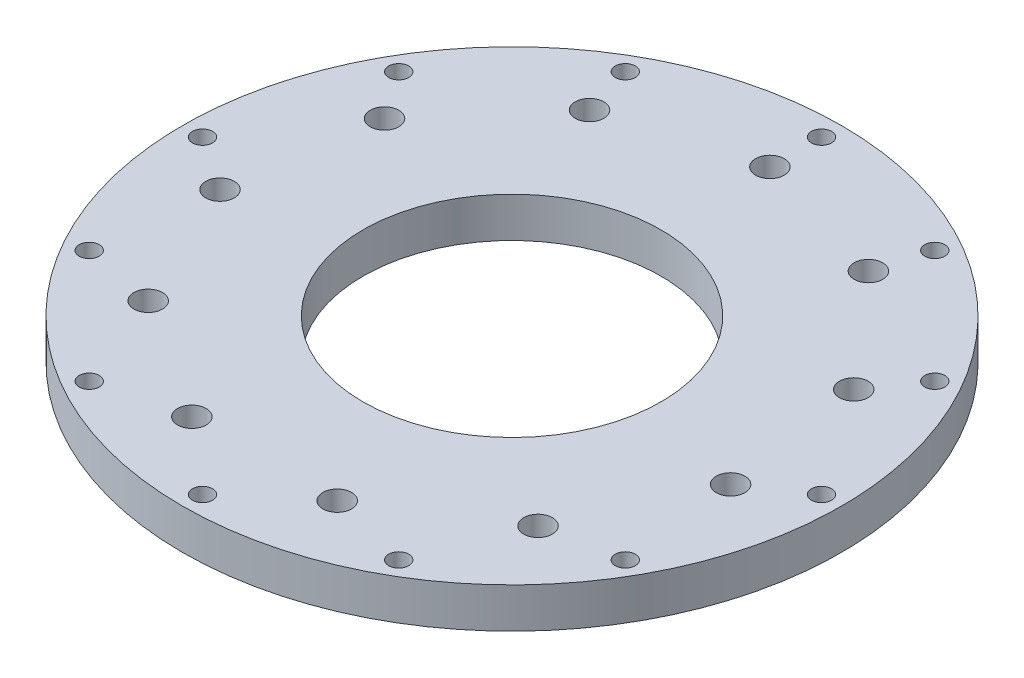
ISO-10303-21;
HEADER;
FILE_DESCRIPTION(('STEP AP214'),'2;1');
FILE_NAME('part.step','',(''),(''),'','','');
FILE_SCHEMA(('AUTOMOTIVE_DESIGN { 1 0 10303 214 1 1 1 1 }'));
ENDSEC;
DATA;
#1=APPLICATION_CONTEXT('core data for automotive mechanical design processes');
#2=APPLICATION_PROTOCOL_DEFINITION('international standard','automotive_design',2000,#1);
#3=PRODUCT_CONTEXT('',#1,'mechanical');
#4=PRODUCT('Part','Part','',(#3));
#5=PRODUCT_RELATED_PRODUCT_CATEGORY('part','',(#4));
#6=PRODUCT_DEFINITION_FORMATION('','',#4);
#7=PRODUCT_DEFINITION_CONTEXT('part definition',#1,'design');
#8=PRODUCT_DEFINITION('design','',#6,#7);
#9=PRODUCT_DEFINITION_SHAPE('','',#8);
#10=(LENGTH_UNIT() NAMED_UNIT(*) SI_UNIT(.MILLI.,.METRE.));
#11=(NAMED_UNIT(*) PLANE_ANGLE_UNIT() SI_UNIT($,.RADIAN.));
#12=(NAMED_UNIT(*) SI_UNIT($,.STERADIAN.) SOLID_ANGLE_UNIT());
#13=UNCERTAINTY_MEASURE_WITH_UNIT(LENGTH_MEASURE(1.E-05),#10,'distance_accuracy_value','');
#14=(GEOMETRIC_REPRESENTATION_CONTEXT(3) GLOBAL_UNCERTAINTY_ASSIGNED_CONTEXT((#13)) GLOBAL_UNIT_ASSIGNED_CONTEXT((#10,
#11,#12)) REPRESENTATION_CONTEXT('',''));
#15=CARTESIAN_POINT('',(0.,0.,0.));
#16=DIRECTION('',(0.,0.,1.));
#17=DIRECTION('',(1.,0.,0.));
#18=AXIS2_PLACEMENT_3D('',#15,#16,#17);
#19=CARTESIAN_POINT('',(0.,7.,0.));
#20=DIRECTION('',(0.,1.,0.));
#21=DIRECTION('',(0.,0.,1.));
#22=AXIS2_PLACEMENT_3D('',#19,#20,#21);
#23=PLANE('',#22);
#24=CARTESIAN_POINT('',(-40.9334397909518,7.,-18.6936755850826));
#25=DIRECTION('',(0.,1.,0.));
#26=DIRECTION('',(0.,0.,1.));
#27=AXIS2_PLACEMENT_3D('',#24,#25,#26);
#28=CIRCLE('',#27,2.50000000000264);
#29=CARTESIAN_POINT('',(-40.9334397909518,7.,-16.1936755850799));
#30=VERTEX_POINT('',#29);
#31=EDGE_CURVE('E173',#30,#30,#28,.T.);
#32=ORIENTED_EDGE('',*,*,#31,.F.);
#33=EDGE_LOOP('',(#32));
#34=FACE_BOUND('',#33,.T.);
#35=CARTESIAN_POINT('',(-34.0087308459374,7.,29.4687330275398));
#36=DIRECTION('',(0.,1.,0.));
#37=DIRECTION('',(0.,0.,1.));
#38=AXIS2_PLACEMENT_3D('',#35,#36,#37);
#39=CIRCLE('',#38,2.50000000000499);
#40=CARTESIAN_POINT('',(-34.0087308459374,7.,31.9687330275448));
#41=VERTEX_POINT('',#40);
#42=EDGE_CURVE('E161',#41,#41,#39,.T.);
#43=ORIENTED_EDGE('',*,*,#42,.F.);
#44=EDGE_LOOP('',(#43));
#45=FACE_BOUND('',#44,.T.);
#46=CARTESIAN_POINT('',(12.6779650578693,7.,43.1771838126517));
#47=DIRECTION('',(0.,1.,0.));
#48=DIRECTION('',(0.,0.,1.));
#49=AXIS2_PLACEMENT_3D('',#46,#47,#48);
#50=CIRCLE('',#49,2.50000000000485);
#51=CARTESIAN_POINT('',(12.6779650578693,7.,45.6771838126565));
#52=VERTEX_POINT('',#51);
#53=EDGE_CURVE('E149',#52,#52,#50,.T.);
#54=ORIENTED_EDGE('',*,*,#53,.F.);
#55=EDGE_LOOP('',(#54));
#56=FACE_BOUND('',#55,.T.);
#57=CARTESIAN_POINT('',(44.5419648846449,7.,6.4041677222953));
#58=DIRECTION('',(0.,1.,0.));
#59=DIRECTION('',(0.,0.,1.));
#60=AXIS2_PLACEMENT_3D('',#57,#58,#59);
#61=CIRCLE('',#60,2.50000000000221);
#62=CARTESIAN_POINT('',(44.5419648846449,7.,8.90416772229752));
#63=VERTEX_POINT('',#62);
#64=EDGE_CURVE('E137',#63,#63,#61,.T.);
#65=ORIENTED_EDGE('',*,*,#64,.F.);
#66=EDGE_LOOP('',(#65));
#67=FACE_BOUND('',#66,.T.);
#68=CARTESIAN_POINT('',(24.3288367855023,7.,-37.8564089774045));
#69=DIRECTION('',(0.,1.,0.));
#70=DIRECTION('',(0.,0.,1.));
#71=AXIS2_PLACEMENT_3D('',#68,#69,#70);
#72=CIRCLE('',#71,2.50000000000002);
#73=CARTESIAN_POINT('',(24.3288367855023,7.,-35.3564089774045));
#74=VERTEX_POINT('',#73);
#75=EDGE_CURVE('E125',#74,#74,#72,.T.);
#76=ORIENTED_EDGE('',*,*,#75,.F.);
#77=EDGE_LOOP('',(#76));
#78=FACE_BOUND('',#77,.T.);
#79=CARTESIAN_POINT('',(-26.9999999999997,7.,-46.7653718043585));
#80=DIRECTION('',(0.,1.,0.));
#81=DIRECTION('',(0.,0.,1.));
#82=AXIS2_PLACEMENT_3D('',#79,#80,#81);
#83=CIRCLE('',#82,1.75);
#84=CARTESIAN_POINT('',(-26.9999999999997,7.,-45.0153718043585));
#85=VERTEX_POINT('',#84);
#86=EDGE_CURVE('E113',#85,#85,#83,.T.);
#87=ORIENTED_EDGE('',*,*,#86,.F.);
#88=EDGE_LOOP('',(#87));
#89=FACE_BOUND('',#88,.T.);
#90=CARTESIAN_POINT('',(-53.9999999999977,7.,2.3412395522908E-12));
#91=DIRECTION('',(0.,1.,0.));
#92=DIRECTION('',(0.,0.,1.));
#93=AXIS2_PLACEMENT_3D('',#90,#91,#92);
#94=CIRCLE('',#93,1.75);
#95=CARTESIAN_POINT('',(-53.9999999999977,7.,1.75000000000234));
#96=VERTEX_POINT('',#95);
#97=EDGE_CURVE('E101',#96,#96,#94,.T.);
#98=ORIENTED_EDGE('',*,*,#97,.F.);
#99=EDGE_LOOP('',(#98));
#100=FACE_BOUND('',#99,.T.);
#101=CARTESIAN_POINT('',(-26.9999999999956,7.,46.7653718043609));
#102=DIRECTION('',(0.,1.,0.));
#103=DIRECTION('',(0.,0.,1.));
#104=AXIS2_PLACEMENT_3D('',#101,#102,#103);
#105=CIRCLE('',#104,1.75);
#106=CARTESIAN_POINT('',(-26.9999999999956,7.,48.5153718043609));
#107=VERTEX_POINT('',#106);
#108=EDGE_CURVE('E89',#107,#107,#105,.T.);
#109=ORIENTED_EDGE('',*,*,#108,.F.);
#110=EDGE_LOOP('',(#109));
#111=FACE_BOUND('',#110,.T.);
#112=CARTESIAN_POINT('',(27.0000000000044,7.,46.7653718043585));
#113=DIRECTION('',(0.,1.,0.));
#114=DIRECTION('',(0.,0.,1.));
#115=AXIS2_PLACEMENT_3D('',#112,#113,#114);
#116=CIRCLE('',#115,1.75);
#117=CARTESIAN_POINT('',(27.0000000000044,7.,48.5153718043585));
#118=VERTEX_POINT('',#117);
#119=EDGE_CURVE('E77',#118,#118,#116,.T.);
#120=ORIENTED_EDGE('',*,*,#119,.F.);
#121=EDGE_LOOP('',(#120));
#122=FACE_BOUND('',#121,.T.);
#123=CARTESIAN_POINT('',(54.0000000000023,7.,-2.33462645957541E-12));
#124=DIRECTION('',(0.,1.,0.));
#125=DIRECTION('',(0.,0.,1.));
#126=AXIS2_PLACEMENT_3D('',#123,#124,#125);
#127=CIRCLE('',#126,1.75);
#128=CARTESIAN_POINT('',(54.0000000000023,7.,1.74999999999767));
#129=VERTEX_POINT('',#128);
#130=EDGE_CURVE('E65',#129,#129,#127,.T.);
#131=ORIENTED_EDGE('',*,*,#130,.F.);
#132=EDGE_LOOP('',(#131));
#133=FACE_BOUND('',#132,.T.);
#134=CARTESIAN_POINT('',(27.0000000000003,7.,-46.7653718043608));
#135=DIRECTION('',(0.,1.,0.));
#136=DIRECTION('',(0.,0.,1.));
#137=AXIS2_PLACEMENT_3D('',#134,#135,#136);
#138=CIRCLE('',#137,1.75);
#139=CARTESIAN_POINT('',(27.0000000000003,7.,-45.0153718043608));
#140=VERTEX_POINT('',#139);
#141=EDGE_CURVE('E53',#140,#140,#138,.T.);
#142=ORIENTED_EDGE('',*,*,#141,.F.);
#143=EDGE_LOOP('',(#142));
#144=FACE_BOUND('',#143,.T.);
#145=CARTESIAN_POINT('',(0.,7.,-54.));
#146=DIRECTION('',(0.,1.,0.));
#147=DIRECTION('',(0.,0.,1.));
#148=AXIS2_PLACEMENT_3D('',#145,#146,#147);
#149=CIRCLE('',#148,1.75);
#150=CARTESIAN_POINT('',(0.,7.,-52.25));
#151=VERTEX_POINT('',#150);
#152=EDGE_CURVE('E42',#151,#151,#149,.T.);
#153=ORIENTED_EDGE('',*,*,#152,.F.);
#154=EDGE_LOOP('',(#153));
#155=FACE_BOUND('',#154,.T.);
#156=CARTESIAN_POINT('',(0.,7.,0.));
#157=DIRECTION('',(0.,1.,0.));
#158=DIRECTION('',(0.,0.,1.));
#159=AXIS2_PLACEMENT_3D('',#156,#157,#158);
#160=CIRCLE('',#159,57.5);
#161=CARTESIAN_POINT('',(0.,7.,57.5));
#162=VERTEX_POINT('',#161);
#163=EDGE_CURVE('E10',#162,#162,#160,.T.);
#164=ORIENTED_EDGE('',*,*,#163,.T.);
#165=EDGE_LOOP('',(#164));
#166=FACE_BOUND('',#165,.T.);
#167=CARTESIAN_POINT('',(0.,7.,0.));
#168=DIRECTION('',(0.,1.,0.));
#169=DIRECTION('',(0.,0.,1.));
#170=AXIS2_PLACEMENT_3D('',#167,#168,#169);
#171=CIRCLE('',#170,26.);
#172=CARTESIAN_POINT('',(0.,7.,26.));
#173=VERTEX_POINT('',#172);
#174=EDGE_CURVE('E47',#173,#173,#171,.T.);
#175=ORIENTED_EDGE('',*,*,#174,.F.);
#176=EDGE_LOOP('',(#175));
#177=FACE_BOUND('',#176,.T.);
#178=CARTESIAN_POINT('',(46.7653718043608,7.,-27.000000000002));
#179=DIRECTION('',(0.,1.,0.));
#180=DIRECTION('',(0.,0.,1.));
#181=AXIS2_PLACEMENT_3D('',#178,#179,#180);
#182=CIRCLE('',#181,1.75);
#183=CARTESIAN_POINT('',(46.7653718043608,7.,-25.250000000002));
#184=VERTEX_POINT('',#183);
#185=EDGE_CURVE('E59',#184,#184,#182,.T.);
#186=ORIENTED_EDGE('',*,*,#185,.F.);
#187=EDGE_LOOP('',(#186));
#188=FACE_BOUND('',#187,.T.);
#189=CARTESIAN_POINT('',(46.7653718043632,7.,26.999999999998));
#190=DIRECTION('',(0.,1.,0.));
#191=DIRECTION('',(0.,0.,1.));
#192=AXIS2_PLACEMENT_3D('',#189,#190,#191);
#193=CIRCLE('',#192,1.75);
#194=CARTESIAN_POINT('',(46.7653718043632,7.,28.749999999998));
#195=VERTEX_POINT('',#194);
#196=EDGE_CURVE('E71',#195,#195,#193,.T.);
#197=ORIENTED_EDGE('',*,*,#196,.F.);
#198=EDGE_LOOP('',(#197));
#199=FACE_BOUND('',#198,.T.);
#200=CARTESIAN_POINT('',(4.66925291915082E-12,7.,54.));
#201=DIRECTION('',(0.,1.,0.));
#202=DIRECTION('',(0.,0.,1.));
#203=AXIS2_PLACEMENT_3D('',#200,#201,#202);
#204=CIRCLE('',#203,1.75);
#205=CARTESIAN_POINT('',(4.66925291915082E-12,7.,55.75));
#206=VERTEX_POINT('',#205);
#207=EDGE_CURVE('E83',#206,#206,#204,.T.);
#208=ORIENTED_EDGE('',*,*,#207,.F.);
#209=EDGE_LOOP('',(#208));
#210=FACE_BOUND('',#209,.T.);
#211=CARTESIAN_POINT('',(-46.7653718043562,7.,27.000000000002));
#212=DIRECTION('',(0.,1.,0.));
#213=DIRECTION('',(0.,0.,1.));
#214=AXIS2_PLACEMENT_3D('',#211,#212,#213);
#215=CIRCLE('',#214,1.75);
#216=CARTESIAN_POINT('',(-46.7653718043562,7.,28.750000000002));
#217=VERTEX_POINT('',#216);
#218=EDGE_CURVE('E95',#217,#217,#215,.T.);
#219=ORIENTED_EDGE('',*,*,#218,.F.);
#220=EDGE_LOOP('',(#219));
#221=FACE_BOUND('',#220,.T.);
#222=CARTESIAN_POINT('',(-46.7653718043585,7.,-26.9999999999979));
#223=DIRECTION('',(0.,1.,0.));
#224=DIRECTION('',(0.,0.,1.));
#225=AXIS2_PLACEMENT_3D('',#222,#223,#224);
#226=CIRCLE('',#225,1.75);
#227=CARTESIAN_POINT('',(-46.7653718043585,7.,-25.2499999999979));
#228=VERTEX_POINT('',#227);
#229=EDGE_CURVE('E107',#228,#228,#226,.T.);
#230=ORIENTED_EDGE('',*,*,#229,.F.);
#231=EDGE_LOOP('',(#230));
#232=FACE_BOUND('',#231,.T.);
#233=CARTESIAN_POINT('',(0.,7.,-45.));
#234=DIRECTION('',(0.,1.,0.));
#235=DIRECTION('',(0.,0.,1.));
#236=AXIS2_PLACEMENT_3D('',#233,#234,#235);
#237=CIRCLE('',#236,2.5);
#238=CARTESIAN_POINT('',(0.,7.,-42.5));
#239=VERTEX_POINT('',#238);
#240=EDGE_CURVE('E119',#239,#239,#237,.T.);
#241=ORIENTED_EDGE('',*,*,#240,.F.);
#242=EDGE_LOOP('',(#241));
#243=FACE_BOUND('',#242,.T.);
#244=CARTESIAN_POINT('',(40.9334397909548,7.,-18.6936755850872));
#245=DIRECTION('',(0.,1.,0.));
#246=DIRECTION('',(0.,0.,1.));
#247=AXIS2_PLACEMENT_3D('',#244,#245,#246);
#248=CIRCLE('',#247,2.50000000000086);
#249=CARTESIAN_POINT('',(40.9334397909548,7.,-16.1936755850863));
#250=VERTEX_POINT('',#249);
#251=EDGE_CURVE('E131',#250,#250,#248,.T.);
#252=ORIENTED_EDGE('',*,*,#251,.F.);
#253=EDGE_LOOP('',(#252));
#254=FACE_BOUND('',#253,.T.);
#255=CARTESIAN_POINT('',(34.0087308459458,7.,29.4687330275359));
#256=DIRECTION('',(0.,1.,0.));
#257=DIRECTION('',(0.,0.,1.));
#258=AXIS2_PLACEMENT_3D('',#255,#256,#257);
#259=CIRCLE('',#258,2.5000000000037);
#260=CARTESIAN_POINT('',(34.0087308459458,7.,31.9687330275396));
#261=VERTEX_POINT('',#260);
#262=EDGE_CURVE('E143',#261,#261,#259,.T.);
#263=ORIENTED_EDGE('',*,*,#262,.F.);
#264=EDGE_LOOP('',(#263));
#265=FACE_BOUND('',#264,.T.);
#266=CARTESIAN_POINT('',(-12.6779650578593,7.,43.1771838126531));
#267=DIRECTION('',(0.,1.,0.));
#268=DIRECTION('',(0.,0.,1.));
#269=AXIS2_PLACEMENT_3D('',#266,#267,#268);
#270=CIRCLE('',#269,2.50000000000533);
#271=CARTESIAN_POINT('',(-12.6779650578593,7.,45.6771838126584));
#272=VERTEX_POINT('',#271);
#273=EDGE_CURVE('E155',#272,#272,#270,.T.);
#274=ORIENTED_EDGE('',*,*,#273,.F.);
#275=EDGE_LOOP('',(#274));
#276=FACE_BOUND('',#275,.T.);
#277=CARTESIAN_POINT('',(-44.5419648846391,7.,6.40416772230036));
#278=DIRECTION('',(0.,1.,0.));
#279=DIRECTION('',(0.,0.,1.));
#280=AXIS2_PLACEMENT_3D('',#277,#278,#279);
#281=CIRCLE('',#280,2.50000000000398);
#282=CARTESIAN_POINT('',(-44.5419648846391,7.,8.90416772230433));
#283=VERTEX_POINT('',#282);
#284=EDGE_CURVE('E167',#283,#283,#281,.T.);
#285=ORIENTED_EDGE('',*,*,#284,.F.);
#286=EDGE_LOOP('',(#285));
#287=FACE_BOUND('',#286,.T.);
#288=CARTESIAN_POINT('',(-24.3288367855015,7.,-37.8564089774018));
#289=DIRECTION('',(0.,1.,0.));
#290=DIRECTION('',(0.,0.,1.));
#291=AXIS2_PLACEMENT_3D('',#288,#289,#290);
#292=CIRCLE('',#291,2.50000000000136);
#293=CARTESIAN_POINT('',(-24.3288367855015,7.,-35.3564089774004));
#294=VERTEX_POINT('',#293);
#295=EDGE_CURVE('E179',#294,#294,#292,.T.);
#296=ORIENTED_EDGE('',*,*,#295,.F.);
#297=EDGE_LOOP('',(#296));
#298=FACE_BOUND('',#297,.T.);
#299=ADVANCED_FACE('F31',(#34,#45,#56,#67,#78,#89,#100,#111,#122,#133,#144,#155,#166,#177,#188,
#199,#210,#221,#232,#243,#254,#265,#276,#287,#298),#23,.T.);
#300=CARTESIAN_POINT('',(0.,0.,0.));
#301=DIRECTION('',(0.,1.,0.));
#302=DIRECTION('',(0.,0.,1.));
#303=AXIS2_PLACEMENT_3D('',#300,#301,#302);
#304=PLANE('',#303);
#305=CARTESIAN_POINT('',(0.,0.,0.));
#306=DIRECTION('',(0.,1.,0.));
#307=DIRECTION('',(0.,0.,1.));
#308=AXIS2_PLACEMENT_3D('',#305,#306,#307);
#309=CIRCLE('',#308,57.5);
#310=CARTESIAN_POINT('',(0.,0.,57.5));
#311=VERTEX_POINT('',#310);
#312=EDGE_CURVE('E35',#311,#311,#309,.T.);
#313=ORIENTED_EDGE('',*,*,#312,.F.);
#314=EDGE_LOOP('',(#313));
#315=FACE_BOUND('',#314,.T.);
#316=CARTESIAN_POINT('',(0.,0.,-54.));
#317=DIRECTION('',(0.,1.,0.));
#318=DIRECTION('',(0.,0.,1.));
#319=AXIS2_PLACEMENT_3D('',#316,#317,#318);
#320=CIRCLE('',#319,1.75);
#321=CARTESIAN_POINT('',(0.,0.,-52.25));
#322=VERTEX_POINT('',#321);
#323=EDGE_CURVE('E44',#322,#322,#320,.T.);
#324=ORIENTED_EDGE('',*,*,#323,.T.);
#325=EDGE_LOOP('',(#324));
#326=FACE_BOUND('',#325,.T.);
#327=CARTESIAN_POINT('',(0.,0.,0.));
#328=DIRECTION('',(0.,1.,0.));
#329=DIRECTION('',(0.,0.,1.));
#330=AXIS2_PLACEMENT_3D('',#327,#328,#329);
#331=CIRCLE('',#330,26.);
#332=CARTESIAN_POINT('',(0.,0.,26.));
#333=VERTEX_POINT('',#332);
#334=EDGE_CURVE('E50',#333,#333,#331,.T.);
#335=ORIENTED_EDGE('',*,*,#334,.T.);
#336=EDGE_LOOP('',(#335));
#337=FACE_BOUND('',#336,.T.);
#338=CARTESIAN_POINT('',(27.0000000000003,0.,-46.7653718043608));
#339=DIRECTION('',(0.,1.,0.));
#340=DIRECTION('',(0.,0.,1.));
#341=AXIS2_PLACEMENT_3D('',#338,#339,#340);
#342=CIRCLE('',#341,1.75);
#343=CARTESIAN_POINT('',(27.0000000000003,0.,-45.0153718043608));
#344=VERTEX_POINT('',#343);
#345=EDGE_CURVE('E56',#344,#344,#342,.T.);
#346=ORIENTED_EDGE('',*,*,#345,.T.);
#347=EDGE_LOOP('',(#346));
#348=FACE_BOUND('',#347,.T.);
#349=CARTESIAN_POINT('',(46.7653718043608,0.,-27.000000000002));
#350=DIRECTION('',(0.,1.,0.));
#351=DIRECTION('',(0.,0.,1.));
#352=AXIS2_PLACEMENT_3D('',#349,#350,#351);
#353=CIRCLE('',#352,1.75);
#354=CARTESIAN_POINT('',(46.7653718043608,0.,-25.250000000002));
#355=VERTEX_POINT('',#354);
#356=EDGE_CURVE('E62',#355,#355,#353,.T.);
#357=ORIENTED_EDGE('',*,*,#356,.T.);
#358=EDGE_LOOP('',(#357));
#359=FACE_BOUND('',#358,.T.);
#360=CARTESIAN_POINT('',(54.0000000000023,0.,-2.33462645957541E-12));
#361=DIRECTION('',(0.,1.,0.));
#362=DIRECTION('',(0.,0.,1.));
#363=AXIS2_PLACEMENT_3D('',#360,#361,#362);
#364=CIRCLE('',#363,1.75);
#365=CARTESIAN_POINT('',(54.0000000000023,0.,1.74999999999767));
#366=VERTEX_POINT('',#365);
#367=EDGE_CURVE('E68',#366,#366,#364,.T.);
#368=ORIENTED_EDGE('',*,*,#367,.T.);
#369=EDGE_LOOP('',(#368));
#370=FACE_BOUND('',#369,.T.);
#371=CARTESIAN_POINT('',(46.7653718043632,0.,26.999999999998));
#372=DIRECTION('',(0.,1.,0.));
#373=DIRECTION('',(0.,0.,1.));
#374=AXIS2_PLACEMENT_3D('',#371,#372,#373);
#375=CIRCLE('',#374,1.75);
#376=CARTESIAN_POINT('',(46.7653718043632,0.,28.749999999998));
#377=VERTEX_POINT('',#376);
#378=EDGE_CURVE('E74',#377,#377,#375,.T.);
#379=ORIENTED_EDGE('',*,*,#378,.T.);
#380=EDGE_LOOP('',(#379));
#381=FACE_BOUND('',#380,.T.);
#382=CARTESIAN_POINT('',(27.0000000000044,0.,46.7653718043585));
#383=DIRECTION('',(0.,1.,0.));
#384=DIRECTION('',(0.,0.,1.));
#385=AXIS2_PLACEMENT_3D('',#382,#383,#384);
#386=CIRCLE('',#385,1.75);
#387=CARTESIAN_POINT('',(27.0000000000044,0.,48.5153718043585));
#388=VERTEX_POINT('',#387);
#389=EDGE_CURVE('E80',#388,#388,#386,.T.);
#390=ORIENTED_EDGE('',*,*,#389,.T.);
#391=EDGE_LOOP('',(#390));
#392=FACE_BOUND('',#391,.T.);
#393=CARTESIAN_POINT('',(4.66925291915082E-12,0.,54.));
#394=DIRECTION('',(0.,1.,0.));
#395=DIRECTION('',(0.,0.,1.));
#396=AXIS2_PLACEMENT_3D('',#393,#394,#395);
#397=CIRCLE('',#396,1.75);
#398=CARTESIAN_POINT('',(4.66925291915082E-12,0.,55.75));
#399=VERTEX_POINT('',#398);
#400=EDGE_CURVE('E86',#399,#399,#397,.T.);
#401=ORIENTED_EDGE('',*,*,#400,.T.);
#402=EDGE_LOOP('',(#401));
#403=FACE_BOUND('',#402,.T.);
#404=CARTESIAN_POINT('',(-26.9999999999956,0.,46.7653718043609));
#405=DIRECTION('',(0.,1.,0.));
#406=DIRECTION('',(0.,0.,1.));
#407=AXIS2_PLACEMENT_3D('',#404,#405,#406);
#408=CIRCLE('',#407,1.75);
#409=CARTESIAN_POINT('',(-26.9999999999956,0.,48.5153718043609));
#410=VERTEX_POINT('',#409);
#411=EDGE_CURVE('E92',#410,#410,#408,.T.);
#412=ORIENTED_EDGE('',*,*,#411,.T.);
#413=EDGE_LOOP('',(#412));
#414=FACE_BOUND('',#413,.T.);
#415=CARTESIAN_POINT('',(-46.7653718043562,0.,27.000000000002));
#416=DIRECTION('',(0.,1.,0.));
#417=DIRECTION('',(0.,0.,1.));
#418=AXIS2_PLACEMENT_3D('',#415,#416,#417);
#419=CIRCLE('',#418,1.75);
#420=CARTESIAN_POINT('',(-46.7653718043562,0.,28.750000000002));
#421=VERTEX_POINT('',#420);
#422=EDGE_CURVE('E98',#421,#421,#419,.T.);
#423=ORIENTED_EDGE('',*,*,#422,.T.);
#424=EDGE_LOOP('',(#423));
#425=FACE_BOUND('',#424,.T.);
#426=CARTESIAN_POINT('',(-53.9999999999977,0.,2.3412395522908E-12));
#427=DIRECTION('',(0.,1.,0.));
#428=DIRECTION('',(0.,0.,1.));
#429=AXIS2_PLACEMENT_3D('',#426,#427,#428);
#430=CIRCLE('',#429,1.75);
#431=CARTESIAN_POINT('',(-53.9999999999977,0.,1.75000000000234));
#432=VERTEX_POINT('',#431);
#433=EDGE_CURVE('E104',#432,#432,#430,.T.);
#434=ORIENTED_EDGE('',*,*,#433,.T.);
#435=EDGE_LOOP('',(#434));
#436=FACE_BOUND('',#435,.T.);
#437=CARTESIAN_POINT('',(-46.7653718043585,0.,-26.9999999999979));
#438=DIRECTION('',(0.,1.,0.));
#439=DIRECTION('',(0.,0.,1.));
#440=AXIS2_PLACEMENT_3D('',#437,#438,#439);
#441=CIRCLE('',#440,1.75);
#442=CARTESIAN_POINT('',(-46.7653718043585,0.,-25.2499999999979));
#443=VERTEX_POINT('',#442);
#444=EDGE_CURVE('E110',#443,#443,#441,.T.);
#445=ORIENTED_EDGE('',*,*,#444,.T.);
#446=EDGE_LOOP('',(#445));
#447=FACE_BOUND('',#446,.T.);
#448=CARTESIAN_POINT('',(-26.9999999999997,0.,-46.7653718043585));
#449=DIRECTION('',(0.,1.,0.));
#450=DIRECTION('',(0.,0.,1.));
#451=AXIS2_PLACEMENT_3D('',#448,#449,#450);
#452=CIRCLE('',#451,1.75);
#453=CARTESIAN_POINT('',(-26.9999999999997,0.,-45.0153718043585));
#454=VERTEX_POINT('',#453);
#455=EDGE_CURVE('E116',#454,#454,#452,.T.);
#456=ORIENTED_EDGE('',*,*,#455,.T.);
#457=EDGE_LOOP('',(#456));
#458=FACE_BOUND('',#457,.T.);
#459=CARTESIAN_POINT('',(0.,0.,-45.));
#460=DIRECTION('',(0.,1.,0.));
#461=DIRECTION('',(0.,0.,1.));
#462=AXIS2_PLACEMENT_3D('',#459,#460,#461);
#463=CIRCLE('',#462,2.5);
#464=CARTESIAN_POINT('',(0.,0.,-42.5));
#465=VERTEX_POINT('',#464);
#466=EDGE_CURVE('E122',#465,#465,#463,.T.);
#467=ORIENTED_EDGE('',*,*,#466,.T.);
#468=EDGE_LOOP('',(#467));
#469=FACE_BOUND('',#468,.T.);
#470=CARTESIAN_POINT('',(24.3288367855023,0.,-37.8564089774045));
#471=DIRECTION('',(0.,1.,0.));
#472=DIRECTION('',(0.,0.,1.));
#473=AXIS2_PLACEMENT_3D('',#470,#471,#472);
#474=CIRCLE('',#473,2.50000000000002);
#475=CARTESIAN_POINT('',(24.3288367855023,0.,-35.3564089774045));
#476=VERTEX_POINT('',#475);
#477=EDGE_CURVE('E128',#476,#476,#474,.T.);
#478=ORIENTED_EDGE('',*,*,#477,.T.);
#479=EDGE_LOOP('',(#478));
#480=FACE_BOUND('',#479,.T.);
#481=CARTESIAN_POINT('',(40.9334397909548,0.,-18.6936755850872));
#482=DIRECTION('',(0.,1.,0.));
#483=DIRECTION('',(0.,0.,1.));
#484=AXIS2_PLACEMENT_3D('',#481,#482,#483);
#485=CIRCLE('',#484,2.50000000000086);
#486=CARTESIAN_POINT('',(40.9334397909548,0.,-16.1936755850863));
#487=VERTEX_POINT('',#486);
#488=EDGE_CURVE('E134',#487,#487,#485,.T.);
#489=ORIENTED_EDGE('',*,*,#488,.T.);
#490=EDGE_LOOP('',(#489));
#491=FACE_BOUND('',#490,.T.);
#492=CARTESIAN_POINT('',(44.5419648846449,0.,6.4041677222953));
#493=DIRECTION('',(0.,1.,0.));
#494=DIRECTION('',(0.,0.,1.));
#495=AXIS2_PLACEMENT_3D('',#492,#493,#494);
#496=CIRCLE('',#495,2.50000000000221);
#497=CARTESIAN_POINT('',(44.5419648846449,0.,8.90416772229752));
#498=VERTEX_POINT('',#497);
#499=EDGE_CURVE('E140',#498,#498,#496,.T.);
#500=ORIENTED_EDGE('',*,*,#499,.T.);
#501=EDGE_LOOP('',(#500));
#502=FACE_BOUND('',#501,.T.);
#503=CARTESIAN_POINT('',(34.0087308459458,0.,29.4687330275359));
#504=DIRECTION('',(0.,1.,0.));
#505=DIRECTION('',(0.,0.,1.));
#506=AXIS2_PLACEMENT_3D('',#503,#504,#505);
#507=CIRCLE('',#506,2.5000000000037);
#508=CARTESIAN_POINT('',(34.0087308459458,0.,31.9687330275396));
#509=VERTEX_POINT('',#508);
#510=EDGE_CURVE('E146',#509,#509,#507,.T.);
#511=ORIENTED_EDGE('',*,*,#510,.T.);
#512=EDGE_LOOP('',(#511));
#513=FACE_BOUND('',#512,.T.);
#514=CARTESIAN_POINT('',(12.6779650578693,0.,43.1771838126517));
#515=DIRECTION('',(0.,1.,0.));
#516=DIRECTION('',(0.,0.,1.));
#517=AXIS2_PLACEMENT_3D('',#514,#515,#516);
#518=CIRCLE('',#517,2.50000000000485);
#519=CARTESIAN_POINT('',(12.6779650578693,0.,45.6771838126565));
#520=VERTEX_POINT('',#519);
#521=EDGE_CURVE('E152',#520,#520,#518,.T.);
#522=ORIENTED_EDGE('',*,*,#521,.T.);
#523=EDGE_LOOP('',(#522));
#524=FACE_BOUND('',#523,.T.);
#525=CARTESIAN_POINT('',(-12.6779650578593,0.,43.1771838126531));
#526=DIRECTION('',(0.,1.,0.));
#527=DIRECTION('',(0.,0.,1.));
#528=AXIS2_PLACEMENT_3D('',#525,#526,#527);
#529=CIRCLE('',#528,2.50000000000533);
#530=CARTESIAN_POINT('',(-12.6779650578593,0.,45.6771838126584));
#531=VERTEX_POINT('',#530);
#532=EDGE_CURVE('E158',#531,#531,#529,.T.);
#533=ORIENTED_EDGE('',*,*,#532,.T.);
#534=EDGE_LOOP('',(#533));
#535=FACE_BOUND('',#534,.T.);
#536=CARTESIAN_POINT('',(-34.0087308459374,0.,29.4687330275398));
#537=DIRECTION('',(0.,1.,0.));
#538=DIRECTION('',(0.,0.,1.));
#539=AXIS2_PLACEMENT_3D('',#536,#537,#538);
#540=CIRCLE('',#539,2.50000000000499);
#541=CARTESIAN_POINT('',(-34.0087308459374,0.,31.9687330275448));
#542=VERTEX_POINT('',#541);
#543=EDGE_CURVE('E164',#542,#542,#540,.T.);
#544=ORIENTED_EDGE('',*,*,#543,.T.);
#545=EDGE_LOOP('',(#544));
#546=FACE_BOUND('',#545,.T.);
#547=CARTESIAN_POINT('',(-44.5419648846391,0.,6.40416772230036));
#548=DIRECTION('',(0.,1.,0.));
#549=DIRECTION('',(0.,0.,1.));
#550=AXIS2_PLACEMENT_3D('',#547,#548,#549);
#551=CIRCLE('',#550,2.50000000000398);
#552=CARTESIAN_POINT('',(-44.5419648846391,0.,8.90416772230433));
#553=VERTEX_POINT('',#552);
#554=EDGE_CURVE('E170',#553,#553,#551,.T.);
#555=ORIENTED_EDGE('',*,*,#554,.T.);
#556=EDGE_LOOP('',(#555));
#557=FACE_BOUND('',#556,.T.);
#558=CARTESIAN_POINT('',(-40.9334397909518,0.,-18.6936755850826));
#559=DIRECTION('',(0.,1.,0.));
#560=DIRECTION('',(0.,0.,1.));
#561=AXIS2_PLACEMENT_3D('',#558,#559,#560);
#562=CIRCLE('',#561,2.50000000000264);
#563=CARTESIAN_POINT('',(-40.9334397909518,0.,-16.1936755850799));
#564=VERTEX_POINT('',#563);
#565=EDGE_CURVE('E176',#564,#564,#562,.T.);
#566=ORIENTED_EDGE('',*,*,#565,.T.);
#567=EDGE_LOOP('',(#566));
#568=FACE_BOUND('',#567,.T.);
#569=CARTESIAN_POINT('',(-24.3288367855015,0.,-37.8564089774018));
#570=DIRECTION('',(0.,1.,0.));
#571=DIRECTION('',(0.,0.,1.));
#572=AXIS2_PLACEMENT_3D('',#569,#570,#571);
#573=CIRCLE('',#572,2.50000000000136);
#574=CARTESIAN_POINT('',(-24.3288367855015,0.,-35.3564089774004));
#575=VERTEX_POINT('',#574);
#576=EDGE_CURVE('E182',#575,#575,#573,.T.);
#577=ORIENTED_EDGE('',*,*,#576,.T.);
#578=EDGE_LOOP('',(#577));
#579=FACE_BOUND('',#578,.T.);
#580=ADVANCED_FACE('F192',(#315,#326,#337,#348,#359,#370,#381,#392,#403,#414,#425,#436,#447,
#458,#469,#480,#491,#502,#513,#524,#535,#546,#557,#568,#579),#304,.F.);
#581=CARTESIAN_POINT('',(0.,7.,0.));
#582=DIRECTION('',(0.,-1.,0.));
#583=DIRECTION('',(0.,0.,-1.));
#584=AXIS2_PLACEMENT_3D('',#581,#582,#583);
#585=CYLINDRICAL_SURFACE('',#584,57.5);
#586=ORIENTED_EDGE('',*,*,#163,.F.);
#587=EDGE_LOOP('',(#586));
#588=FACE_BOUND('',#587,.T.);
#589=ORIENTED_EDGE('',*,*,#312,.T.);
#590=EDGE_LOOP('',(#589));
#591=FACE_BOUND('',#590,.T.);
#592=ADVANCED_FACE('F33',(#588,#591),#585,.T.);
#593=CARTESIAN_POINT('',(0.,7.,-54.));
#594=DIRECTION('',(0.,-1.,0.));
#595=DIRECTION('',(0.,0.,-1.));
#596=AXIS2_PLACEMENT_3D('',#593,#594,#595);
#597=CYLINDRICAL_SURFACE('',#596,1.75);
#598=ORIENTED_EDGE('',*,*,#152,.T.);
#599=EDGE_LOOP('',(#598));
#600=FACE_BOUND('',#599,.T.);
#601=ORIENTED_EDGE('',*,*,#323,.F.);
#602=EDGE_LOOP('',(#601));
#603=FACE_BOUND('',#602,.T.);
#604=ADVANCED_FACE('F202',(#600,#603),#597,.F.);
#605=CARTESIAN_POINT('',(0.,7.,0.));
#606=DIRECTION('',(0.,-1.,0.));
#607=DIRECTION('',(0.,0.,-1.));
#608=AXIS2_PLACEMENT_3D('',#605,#606,#607);
#609=CYLINDRICAL_SURFACE('',#608,26.);
#610=ORIENTED_EDGE('',*,*,#174,.T.);
#611=EDGE_LOOP('',(#610));
#612=FACE_BOUND('',#611,.T.);
#613=ORIENTED_EDGE('',*,*,#334,.F.);
#614=EDGE_LOOP('',(#613));
#615=FACE_BOUND('',#614,.T.);
#616=ADVANCED_FACE('F205',(#612,#615),#609,.F.);
#617=CARTESIAN_POINT('',(27.0000000000003,7.,-46.7653718043608));
#618=DIRECTION('',(0.,-1.,0.));
#619=DIRECTION('',(0.,0.,-1.));
#620=AXIS2_PLACEMENT_3D('',#617,#618,#619);
#621=CYLINDRICAL_SURFACE('',#620,1.75);
#622=ORIENTED_EDGE('',*,*,#141,.T.);
#623=EDGE_LOOP('',(#622));
#624=FACE_BOUND('',#623,.T.);
#625=ORIENTED_EDGE('',*,*,#345,.F.);
#626=EDGE_LOOP('',(#625));
#627=FACE_BOUND('',#626,.T.);
#628=ADVANCED_FACE('F209',(#624,#627),#621,.F.);
#629=CARTESIAN_POINT('',(46.7653718043608,7.,-27.000000000002));
#630=DIRECTION('',(0.,-1.,0.));
#631=DIRECTION('',(0.,0.,-1.));
#632=AXIS2_PLACEMENT_3D('',#629,#630,#631);
#633=CYLINDRICAL_SURFACE('',#632,1.75);
#634=ORIENTED_EDGE('',*,*,#185,.T.);
#635=EDGE_LOOP('',(#634));
#636=FACE_BOUND('',#635,.T.);
#637=ORIENTED_EDGE('',*,*,#356,.F.);
#638=EDGE_LOOP('',(#637));
#639=FACE_BOUND('',#638,.T.);
#640=ADVANCED_FACE('F213',(#636,#639),#633,.F.);
#641=CARTESIAN_POINT('',(54.0000000000023,7.,-2.33462645957541E-12));
#642=DIRECTION('',(0.,-1.,0.));
#643=DIRECTION('',(0.,0.,-1.));
#644=AXIS2_PLACEMENT_3D('',#641,#642,#643);
#645=CYLINDRICAL_SURFACE('',#644,1.75);
#646=ORIENTED_EDGE('',*,*,#130,.T.);
#647=EDGE_LOOP('',(#646));
#648=FACE_BOUND('',#647,.T.);
#649=ORIENTED_EDGE('',*,*,#367,.F.);
#650=EDGE_LOOP('',(#649));
#651=FACE_BOUND('',#650,.T.);
#652=ADVANCED_FACE('F217',(#648,#651),#645,.F.);
#653=CARTESIAN_POINT('',(46.7653718043632,7.,26.999999999998));
#654=DIRECTION('',(0.,-1.,0.));
#655=DIRECTION('',(0.,0.,-1.));
#656=AXIS2_PLACEMENT_3D('',#653,#654,#655);
#657=CYLINDRICAL_SURFACE('',#656,1.75);
#658=ORIENTED_EDGE('',*,*,#196,.T.);
#659=EDGE_LOOP('',(#658));
#660=FACE_BOUND('',#659,.T.);
#661=ORIENTED_EDGE('',*,*,#378,.F.);
#662=EDGE_LOOP('',(#661));
#663=FACE_BOUND('',#662,.T.);
#664=ADVANCED_FACE('F221',(#660,#663),#657,.F.);
#665=CARTESIAN_POINT('',(27.0000000000044,7.,46.7653718043585));
#666=DIRECTION('',(0.,-1.,0.));
#667=DIRECTION('',(0.,0.,-1.));
#668=AXIS2_PLACEMENT_3D('',#665,#666,#667);
#669=CYLINDRICAL_SURFACE('',#668,1.75);
#670=ORIENTED_EDGE('',*,*,#119,.T.);
#671=EDGE_LOOP('',(#670));
#672=FACE_BOUND('',#671,.T.);
#673=ORIENTED_EDGE('',*,*,#389,.F.);
#674=EDGE_LOOP('',(#673));
#675=FACE_BOUND('',#674,.T.);
#676=ADVANCED_FACE('F225',(#672,#675),#669,.F.);
#677=CARTESIAN_POINT('',(4.66925291915082E-12,7.,54.));
#678=DIRECTION('',(0.,-1.,0.));
#679=DIRECTION('',(0.,0.,-1.));
#680=AXIS2_PLACEMENT_3D('',#677,#678,#679);
#681=CYLINDRICAL_SURFACE('',#680,1.75);
#682=ORIENTED_EDGE('',*,*,#207,.T.);
#683=EDGE_LOOP('',(#682));
#684=FACE_BOUND('',#683,.T.);
#685=ORIENTED_EDGE('',*,*,#400,.F.);
#686=EDGE_LOOP('',(#685));
#687=FACE_BOUND('',#686,.T.);
#688=ADVANCED_FACE('F229',(#684,#687),#681,.F.);
#689=CARTESIAN_POINT('',(-26.9999999999956,7.,46.7653718043609));
#690=DIRECTION('',(0.,-1.,0.));
#691=DIRECTION('',(0.,0.,-1.));
#692=AXIS2_PLACEMENT_3D('',#689,#690,#691);
#693=CYLINDRICAL_SURFACE('',#692,1.75);
#694=ORIENTED_EDGE('',*,*,#108,.T.);
#695=EDGE_LOOP('',(#694));
#696=FACE_BOUND('',#695,.T.);
#697=ORIENTED_EDGE('',*,*,#411,.F.);
#698=EDGE_LOOP('',(#697));
#699=FACE_BOUND('',#698,.T.);
#700=ADVANCED_FACE('F233',(#696,#699),#693,.F.);
#701=CARTESIAN_POINT('',(-46.7653718043562,7.,27.000000000002));
#702=DIRECTION('',(0.,-1.,0.));
#703=DIRECTION('',(0.,0.,-1.));
#704=AXIS2_PLACEMENT_3D('',#701,#702,#703);
#705=CYLINDRICAL_SURFACE('',#704,1.75);
#706=ORIENTED_EDGE('',*,*,#218,.T.);
#707=EDGE_LOOP('',(#706));
#708=FACE_BOUND('',#707,.T.);
#709=ORIENTED_EDGE('',*,*,#422,.F.);
#710=EDGE_LOOP('',(#709));
#711=FACE_BOUND('',#710,.T.);
#712=ADVANCED_FACE('F237',(#708,#711),#705,.F.);
#713=CARTESIAN_POINT('',(-53.9999999999977,7.,2.3412395522908E-12));
#714=DIRECTION('',(0.,-1.,0.));
#715=DIRECTION('',(0.,0.,-1.));
#716=AXIS2_PLACEMENT_3D('',#713,#714,#715);
#717=CYLINDRICAL_SURFACE('',#716,1.75);
#718=ORIENTED_EDGE('',*,*,#97,.T.);
#719=EDGE_LOOP('',(#718));
#720=FACE_BOUND('',#719,.T.);
#721=ORIENTED_EDGE('',*,*,#433,.F.);
#722=EDGE_LOOP('',(#721));
#723=FACE_BOUND('',#722,.T.);
#724=ADVANCED_FACE('F241',(#720,#723),#717,.F.);
#725=CARTESIAN_POINT('',(-46.7653718043585,7.,-26.9999999999979));
#726=DIRECTION('',(0.,-1.,0.));
#727=DIRECTION('',(0.,0.,-1.));
#728=AXIS2_PLACEMENT_3D('',#725,#726,#727);
#729=CYLINDRICAL_SURFACE('',#728,1.75);
#730=ORIENTED_EDGE('',*,*,#229,.T.);
#731=EDGE_LOOP('',(#730));
#732=FACE_BOUND('',#731,.T.);
#733=ORIENTED_EDGE('',*,*,#444,.F.);
#734=EDGE_LOOP('',(#733));
#735=FACE_BOUND('',#734,.T.);
#736=ADVANCED_FACE('F245',(#732,#735),#729,.F.);
#737=CARTESIAN_POINT('',(-26.9999999999997,7.,-46.7653718043585));
#738=DIRECTION('',(0.,-1.,0.));
#739=DIRECTION('',(0.,0.,-1.));
#740=AXIS2_PLACEMENT_3D('',#737,#738,#739);
#741=CYLINDRICAL_SURFACE('',#740,1.75);
#742=ORIENTED_EDGE('',*,*,#86,.T.);
#743=EDGE_LOOP('',(#742));
#744=FACE_BOUND('',#743,.T.);
#745=ORIENTED_EDGE('',*,*,#455,.F.);
#746=EDGE_LOOP('',(#745));
#747=FACE_BOUND('',#746,.T.);
#748=ADVANCED_FACE('F249',(#744,#747),#741,.F.);
#749=CARTESIAN_POINT('',(0.,7.,-45.));
#750=DIRECTION('',(0.,-1.,0.));
#751=DIRECTION('',(0.,0.,-1.));
#752=AXIS2_PLACEMENT_3D('',#749,#750,#751);
#753=CYLINDRICAL_SURFACE('',#752,2.5);
#754=ORIENTED_EDGE('',*,*,#240,.T.);
#755=EDGE_LOOP('',(#754));
#756=FACE_BOUND('',#755,.T.);
#757=ORIENTED_EDGE('',*,*,#466,.F.);
#758=EDGE_LOOP('',(#757));
#759=FACE_BOUND('',#758,.T.);
#760=ADVANCED_FACE('F253',(#756,#759),#753,.F.);
#761=CARTESIAN_POINT('',(24.3288367855023,7.,-37.8564089774045));
#762=DIRECTION('',(0.,-1.,0.));
#763=DIRECTION('',(0.,0.,-1.));
#764=AXIS2_PLACEMENT_3D('',#761,#762,#763);
#765=CYLINDRICAL_SURFACE('',#764,2.50000000000002);
#766=ORIENTED_EDGE('',*,*,#75,.T.);
#767=EDGE_LOOP('',(#766));
#768=FACE_BOUND('',#767,.T.);
#769=ORIENTED_EDGE('',*,*,#477,.F.);
#770=EDGE_LOOP('',(#769));
#771=FACE_BOUND('',#770,.T.);
#772=ADVANCED_FACE('F257',(#768,#771),#765,.F.);
#773=CARTESIAN_POINT('',(40.9334397909548,7.,-18.6936755850872));
#774=DIRECTION('',(0.,-1.,0.));
#775=DIRECTION('',(0.,0.,-1.));
#776=AXIS2_PLACEMENT_3D('',#773,#774,#775);
#777=CYLINDRICAL_SURFACE('',#776,2.50000000000086);
#778=ORIENTED_EDGE('',*,*,#251,.T.);
#779=EDGE_LOOP('',(#778));
#780=FACE_BOUND('',#779,.T.);
#781=ORIENTED_EDGE('',*,*,#488,.F.);
#782=EDGE_LOOP('',(#781));
#783=FACE_BOUND('',#782,.T.);
#784=ADVANCED_FACE('F261',(#780,#783),#777,.F.);
#785=CARTESIAN_POINT('',(44.5419648846449,7.,6.4041677222953));
#786=DIRECTION('',(0.,-1.,0.));
#787=DIRECTION('',(0.,0.,-1.));
#788=AXIS2_PLACEMENT_3D('',#785,#786,#787);
#789=CYLINDRICAL_SURFACE('',#788,2.50000000000221);
#790=ORIENTED_EDGE('',*,*,#64,.T.);
#791=EDGE_LOOP('',(#790));
#792=FACE_BOUND('',#791,.T.);
#793=ORIENTED_EDGE('',*,*,#499,.F.);
#794=EDGE_LOOP('',(#793));
#795=FACE_BOUND('',#794,.T.);
#796=ADVANCED_FACE('F265',(#792,#795),#789,.F.);
#797=CARTESIAN_POINT('',(34.0087308459458,7.,29.4687330275359));
#798=DIRECTION('',(0.,-1.,0.));
#799=DIRECTION('',(0.,0.,-1.));
#800=AXIS2_PLACEMENT_3D('',#797,#798,#799);
#801=CYLINDRICAL_SURFACE('',#800,2.5000000000037);
#802=ORIENTED_EDGE('',*,*,#262,.T.);
#803=EDGE_LOOP('',(#802));
#804=FACE_BOUND('',#803,.T.);
#805=ORIENTED_EDGE('',*,*,#510,.F.);
#806=EDGE_LOOP('',(#805));
#807=FACE_BOUND('',#806,.T.);
#808=ADVANCED_FACE('F269',(#804,#807),#801,.F.);
#809=CARTESIAN_POINT('',(12.6779650578693,7.,43.1771838126517));
#810=DIRECTION('',(0.,-1.,0.));
#811=DIRECTION('',(0.,0.,-1.));
#812=AXIS2_PLACEMENT_3D('',#809,#810,#811);
#813=CYLINDRICAL_SURFACE('',#812,2.50000000000485);
#814=ORIENTED_EDGE('',*,*,#53,.T.);
#815=EDGE_LOOP('',(#814));
#816=FACE_BOUND('',#815,.T.);
#817=ORIENTED_EDGE('',*,*,#521,.F.);
#818=EDGE_LOOP('',(#817));
#819=FACE_BOUND('',#818,.T.);
#820=ADVANCED_FACE('F273',(#816,#819),#813,.F.);
#821=CARTESIAN_POINT('',(-12.6779650578593,7.,43.1771838126531));
#822=DIRECTION('',(0.,-1.,0.));
#823=DIRECTION('',(0.,0.,-1.));
#824=AXIS2_PLACEMENT_3D('',#821,#822,#823);
#825=CYLINDRICAL_SURFACE('',#824,2.50000000000533);
#826=ORIENTED_EDGE('',*,*,#273,.T.);
#827=EDGE_LOOP('',(#826));
#828=FACE_BOUND('',#827,.T.);
#829=ORIENTED_EDGE('',*,*,#532,.F.);
#830=EDGE_LOOP('',(#829));
#831=FACE_BOUND('',#830,.T.);
#832=ADVANCED_FACE('F277',(#828,#831),#825,.F.);
#833=CARTESIAN_POINT('',(-34.0087308459374,7.,29.4687330275398));
#834=DIRECTION('',(0.,-1.,0.));
#835=DIRECTION('',(0.,0.,-1.));
#836=AXIS2_PLACEMENT_3D('',#833,#834,#835);
#837=CYLINDRICAL_SURFACE('',#836,2.50000000000499);
#838=ORIENTED_EDGE('',*,*,#42,.T.);
#839=EDGE_LOOP('',(#838));
#840=FACE_BOUND('',#839,.T.);
#841=ORIENTED_EDGE('',*,*,#543,.F.);
#842=EDGE_LOOP('',(#841));
#843=FACE_BOUND('',#842,.T.);
#844=ADVANCED_FACE('F281',(#840,#843),#837,.F.);
#845=CARTESIAN_POINT('',(-44.5419648846391,7.,6.40416772230036));
#846=DIRECTION('',(0.,-1.,0.));
#847=DIRECTION('',(0.,0.,-1.));
#848=AXIS2_PLACEMENT_3D('',#845,#846,#847);
#849=CYLINDRICAL_SURFACE('',#848,2.50000000000398);
#850=ORIENTED_EDGE('',*,*,#284,.T.);
#851=EDGE_LOOP('',(#850));
#852=FACE_BOUND('',#851,.T.);
#853=ORIENTED_EDGE('',*,*,#554,.F.);
#854=EDGE_LOOP('',(#853));
#855=FACE_BOUND('',#854,.T.);
#856=ADVANCED_FACE('F285',(#852,#855),#849,.F.);
#857=CARTESIAN_POINT('',(-40.9334397909518,7.,-18.6936755850826));
#858=DIRECTION('',(0.,-1.,0.));
#859=DIRECTION('',(0.,0.,-1.));
#860=AXIS2_PLACEMENT_3D('',#857,#858,#859);
#861=CYLINDRICAL_SURFACE('',#860,2.50000000000264);
#862=ORIENTED_EDGE('',*,*,#31,.T.);
#863=EDGE_LOOP('',(#862));
#864=FACE_BOUND('',#863,.T.);
#865=ORIENTED_EDGE('',*,*,#565,.F.);
#866=EDGE_LOOP('',(#865));
#867=FACE_BOUND('',#866,.T.);
#868=ADVANCED_FACE('F289',(#864,#867),#861,.F.);
#869=CARTESIAN_POINT('',(-24.3288367855015,7.,-37.8564089774018));
#870=DIRECTION('',(0.,-1.,0.));
#871=DIRECTION('',(0.,0.,-1.));
#872=AXIS2_PLACEMENT_3D('',#869,#870,#871);
#873=CYLINDRICAL_SURFACE('',#872,2.50000000000136);
#874=ORIENTED_EDGE('',*,*,#295,.T.);
#875=EDGE_LOOP('',(#874));
#876=FACE_BOUND('',#875,.T.);
#877=ORIENTED_EDGE('',*,*,#576,.F.);
#878=EDGE_LOOP('',(#877));
#879=FACE_BOUND('',#878,.T.);
#880=ADVANCED_FACE('F188',(#876,#879),#873,.F.);
#881=CLOSED_SHELL('',(#299,#580,#592,#604,#616,#628,#640,#652,#664,#676,#688,#700,#712,#724,
#736,#748,#760,#772,#784,#796,#808,#820,#832,#844,#856,#868,#880));
#882=MANIFOLD_SOLID_BREP('B2',#881);
#883=ADVANCED_BREP_SHAPE_REPRESENTATION('',(#18,#882),#14);
#884=SHAPE_DEFINITION_REPRESENTATION(#9,#883);
ENDSEC;
END-ISO-10303-21;
